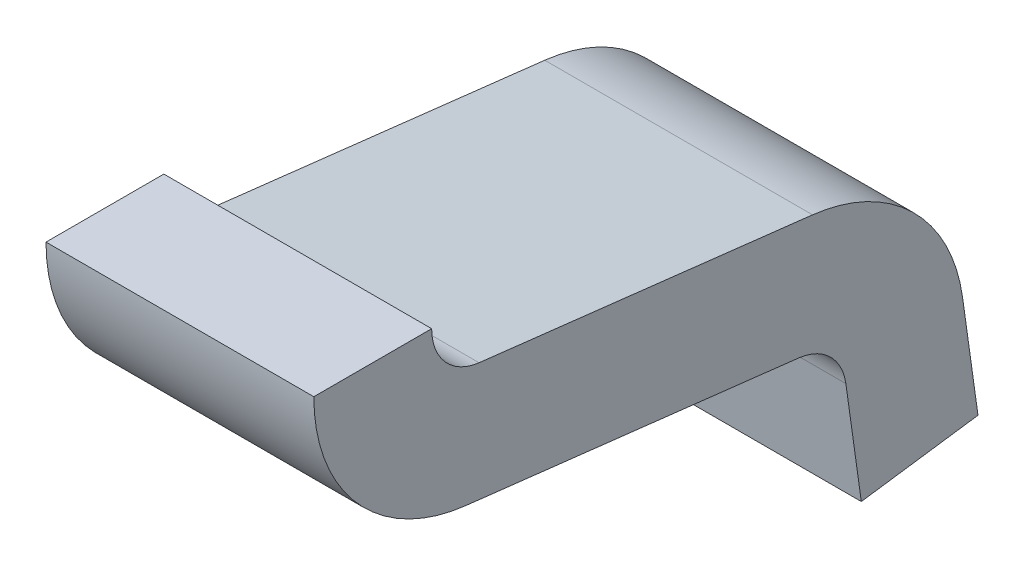
ISO-10303-21;
HEADER;
FILE_DESCRIPTION(('STEP AP214'),'2;1');
FILE_NAME('part.step','',(''),(''),'','','');
FILE_SCHEMA(('AUTOMOTIVE_DESIGN { 1 0 10303 214 1 1 1 1 }'));
ENDSEC;
DATA;
#1=APPLICATION_CONTEXT('core data for automotive mechanical design processes');
#2=APPLICATION_PROTOCOL_DEFINITION('international standard','automotive_design',2000,#1);
#3=PRODUCT_CONTEXT('',#1,'mechanical');
#4=PRODUCT('Part','Part','',(#3));
#5=PRODUCT_RELATED_PRODUCT_CATEGORY('part','',(#4));
#6=PRODUCT_DEFINITION_FORMATION('','',#4);
#7=PRODUCT_DEFINITION_CONTEXT('part definition',#1,'design');
#8=PRODUCT_DEFINITION('design','',#6,#7);
#9=PRODUCT_DEFINITION_SHAPE('','',#8);
#10=(LENGTH_UNIT() NAMED_UNIT(*) SI_UNIT(.MILLI.,.METRE.));
#11=(NAMED_UNIT(*) PLANE_ANGLE_UNIT() SI_UNIT($,.RADIAN.));
#12=(NAMED_UNIT(*) SI_UNIT($,.STERADIAN.) SOLID_ANGLE_UNIT());
#13=UNCERTAINTY_MEASURE_WITH_UNIT(LENGTH_MEASURE(1.E-05),#10,'distance_accuracy_value','');
#14=(GEOMETRIC_REPRESENTATION_CONTEXT(3) GLOBAL_UNCERTAINTY_ASSIGNED_CONTEXT((#13)) GLOBAL_UNIT_ASSIGNED_CONTEXT((#10,
#11,#12)) REPRESENTATION_CONTEXT('',''));
#15=CARTESIAN_POINT('',(0.,0.,0.));
#16=DIRECTION('',(0.,0.,1.));
#17=DIRECTION('',(1.,0.,0.));
#18=AXIS2_PLACEMENT_3D('',#15,#16,#17);
#19=CARTESIAN_POINT('',(0.5,-0.03061808221121,0.217858975123));
#20=DIRECTION('',(0.,0.990268068741588,0.139173100959942));
#21=DIRECTION('',(0.,-0.139173100959942,0.990268068741588));
#22=AXIS2_PLACEMENT_3D('',#19,#20,#21);
#23=PLANE('',#22);
#24=DIRECTION('',(0.,0.139173100960136,-0.99026806874156));
#25=VECTOR('',#24,1.);
#26=CARTESIAN_POINT('',(0.5,-0.03061808221121,0.217858975123));
#27=LINE('',#26,#25);
#28=CARTESIAN_POINT('',(0.5,-0.0306180822112133,0.217858975123023));
#29=VERTEX_POINT('',#28);
#30=CARTESIAN_POINT('',(0.5,0.,0.));
#31=VERTEX_POINT('',#30);
#32=EDGE_CURVE('E108',#29,#31,#27,.T.);
#33=ORIENTED_EDGE('',*,*,#32,.F.);
#34=DIRECTION('',(1.,0.,0.));
#35=VECTOR('',#34,1.);
#36=CARTESIAN_POINT('',(0.5,-0.0306180822112199,0.21785897512307));
#37=LINE('',#36,#35);
#38=CARTESIAN_POINT('',(0.,-0.0306180822112149,0.217858975123035));
#39=VERTEX_POINT('',#38);
#40=EDGE_CURVE('E161',#29,#39,#37,.F.);
#41=ORIENTED_EDGE('',*,*,#40,.T.);
#42=DIRECTION('',(0.,0.139173100960136,-0.99026806874156));
#43=VECTOR('',#42,1.);
#44=CARTESIAN_POINT('',(0.,-0.03061808221121,0.217858975123));
#45=LINE('',#44,#43);
#46=CARTESIAN_POINT('',(0.,0.,0.));
#47=VERTEX_POINT('',#46);
#48=EDGE_CURVE('E100',#39,#47,#45,.T.);
#49=ORIENTED_EDGE('',*,*,#48,.T.);
#50=DIRECTION('',(1.,0.,0.));
#51=VECTOR('',#50,1.);
#52=CARTESIAN_POINT('',(0.5,0.,0.));
#53=LINE('',#52,#51);
#54=EDGE_CURVE('E94',#47,#31,#53,.T.);
#55=ORIENTED_EDGE('',*,*,#54,.T.);
#56=EDGE_LOOP('',(#33,#41,#49,#55));
#57=FACE_BOUND('',#56,.T.);
#58=ADVANCED_FACE('F17',(#57),#23,.F.);
#59=CARTESIAN_POINT('',(0.5,0.,0.));
#60=DIRECTION('',(0.,-0.139173100959942,0.990268068741588));
#61=DIRECTION('',(0.,-0.990268068741588,-0.139173100959942));
#62=AXIS2_PLACEMENT_3D('',#59,#60,#61);
#63=PLANE('',#62);
#64=DIRECTION('',(0.,0.990268068741601,0.139173100959849));
#65=VECTOR('',#64,1.);
#66=CARTESIAN_POINT('',(0.5,0.,0.));
#67=LINE('',#66,#65);
#68=CARTESIAN_POINT('',(0.5,0.205141142117576,0.0288307073448538));
#69=VERTEX_POINT('',#68);
#70=EDGE_CURVE('E110',#31,#69,#67,.T.);
#71=ORIENTED_EDGE('',*,*,#70,.F.);
#72=ORIENTED_EDGE('',*,*,#54,.F.);
#73=DIRECTION('',(0.,0.990268068741601,0.139173100959849));
#74=VECTOR('',#73,1.);
#75=CARTESIAN_POINT('',(0.,0.,0.));
#76=LINE('',#75,#74);
#77=CARTESIAN_POINT('',(0.,0.205141142117576,0.0288307073448538));
#78=VERTEX_POINT('',#77);
#79=EDGE_CURVE('E151',#47,#78,#76,.T.);
#80=ORIENTED_EDGE('',*,*,#79,.T.);
#81=DIRECTION('',(-1.,0.,0.));
#82=VECTOR('',#81,1.);
#83=CARTESIAN_POINT('',(0.5,0.205141142118029,0.0288307073448111));
#84=LINE('',#83,#82);
#85=EDGE_CURVE('E85',#69,#78,#84,.T.);
#86=ORIENTED_EDGE('',*,*,#85,.F.);
#87=EDGE_LOOP('',(#71,#72,#80,#86));
#88=FACE_BOUND('',#87,.T.);
#89=ADVANCED_FACE('F115',(#88),#63,.F.);
#90=CARTESIAN_POINT('',(0.5,0.16060574981,0.345716489342));
#91=DIRECTION('',(-1.,0.,0.));
#92=DIRECTION('',(0.,0.,1.));
#93=AXIS2_PLACEMENT_3D('',#90,#91,#92);
#94=CYLINDRICAL_SURFACE('',#93,0.32);
#95=CARTESIAN_POINT('',(0.,0.16060574981,0.345716489342));
#96=DIRECTION('',(-1.,0.,0.));
#97=DIRECTION('',(0.,0.,1.));
#98=AXIS2_PLACEMENT_3D('',#95,#96,#97);
#99=CIRCLE('',#98,0.32);
#100=CARTESIAN_POINT('',(0.,0.478476552255959,0.308863362572648));
#101=VERTEX_POINT('',#100);
#102=EDGE_CURVE('E20',#78,#101,#99,.F.);
#103=ORIENTED_EDGE('',*,*,#102,.T.);
#104=DIRECTION('',(1.,0.,0.));
#105=VECTOR('',#104,1.);
#106=CARTESIAN_POINT('',(0.5,0.478476552256,0.308863362573));
#107=LINE('',#106,#105);
#108=CARTESIAN_POINT('',(0.5,0.478476552255959,0.308863362572648));
#109=VERTEX_POINT('',#108);
#110=EDGE_CURVE('E165',#101,#109,#107,.T.);
#111=ORIENTED_EDGE('',*,*,#110,.T.);
#112=CARTESIAN_POINT('',(0.5,0.16060574981,0.345716489342));
#113=DIRECTION('',(-1.,0.,0.));
#114=DIRECTION('',(0.,0.,1.));
#115=AXIS2_PLACEMENT_3D('',#112,#113,#114);
#116=CIRCLE('',#115,0.32);
#117=EDGE_CURVE('E116',#69,#109,#116,.F.);
#118=ORIENTED_EDGE('',*,*,#117,.F.);
#119=ORIENTED_EDGE('',*,*,#85,.T.);
#120=EDGE_LOOP('',(#103,#111,#118,#119));
#121=FACE_BOUND('',#120,.T.);
#122=ADVANCED_FACE('F201',(#121),#94,.T.);
#123=CARTESIAN_POINT('',(0.5,0.478476552256,0.308863362573));
#124=DIRECTION('',(0.,-0.99334625764198,0.115166021154998));
#125=DIRECTION('',(0.,-0.115166021154998,-0.99334625764198));
#126=AXIS2_PLACEMENT_3D('',#123,#124,#125);
#127=PLANE('',#126);
#128=DIRECTION('',(0.,0.115166021155147,0.993346257641962));
#129=VECTOR('',#128,1.);
#130=CARTESIAN_POINT('',(0.5,0.478476552256,0.308863362573));
#131=LINE('',#130,#129);
#132=CARTESIAN_POINT('',(0.5,0.550665374235902,0.931516602115257));
#133=VERTEX_POINT('',#132);
#134=EDGE_CURVE('E118',#109,#133,#131,.T.);
#135=ORIENTED_EDGE('',*,*,#134,.F.);
#136=ORIENTED_EDGE('',*,*,#110,.F.);
#137=DIRECTION('',(0.,0.115166021155147,0.993346257641962));
#138=VECTOR('',#137,1.);
#139=CARTESIAN_POINT('',(0.,0.478476552256,0.308863362573));
#140=LINE('',#139,#138);
#141=CARTESIAN_POINT('',(0.,0.550665374235902,0.931516602115257));
#142=VERTEX_POINT('',#141);
#143=EDGE_CURVE('E148',#101,#142,#140,.T.);
#144=ORIENTED_EDGE('',*,*,#143,.T.);
#145=DIRECTION('',(-1.,0.,0.));
#146=VECTOR('',#145,1.);
#147=CARTESIAN_POINT('',(0.5,0.550665374235748,0.931516602115029));
#148=LINE('',#147,#146);
#149=EDGE_CURVE('E162',#142,#133,#148,.F.);
#150=ORIENTED_EDGE('',*,*,#149,.T.);
#151=EDGE_LOOP('',(#135,#136,#144,#150));
#152=FACE_BOUND('',#151,.T.);
#153=ADVANCED_FACE('F200',(#152),#127,.F.);
#154=CARTESIAN_POINT('',(0.5,0.65,0.92));
#155=DIRECTION('',(-1.,0.,0.));
#156=DIRECTION('',(0.,0.,1.));
#157=AXIS2_PLACEMENT_3D('',#154,#155,#156);
#158=CYLINDRICAL_SURFACE('',#157,0.1);
#159=CARTESIAN_POINT('',(0.5,0.65,0.92));
#160=DIRECTION('',(-1.,0.,0.));
#161=DIRECTION('',(0.,0.,1.));
#162=AXIS2_PLACEMENT_3D('',#159,#160,#161);
#163=CIRCLE('',#162,0.1);
#164=CARTESIAN_POINT('',(0.5,0.65,1.02));
#165=VERTEX_POINT('',#164);
#166=EDGE_CURVE('E186',#133,#165,#163,.T.);
#167=ORIENTED_EDGE('',*,*,#166,.F.);
#168=ORIENTED_EDGE('',*,*,#149,.F.);
#169=CARTESIAN_POINT('',(0.,0.65,0.92));
#170=DIRECTION('',(-1.,0.,0.));
#171=DIRECTION('',(0.,0.,1.));
#172=AXIS2_PLACEMENT_3D('',#169,#170,#171);
#173=CIRCLE('',#172,0.1);
#174=CARTESIAN_POINT('',(0.,0.65,1.02));
#175=VERTEX_POINT('',#174);
#176=EDGE_CURVE('E147',#142,#175,#173,.T.);
#177=ORIENTED_EDGE('',*,*,#176,.T.);
#178=DIRECTION('',(1.,0.,0.));
#179=VECTOR('',#178,1.);
#180=CARTESIAN_POINT('',(0.5,0.65,1.02));
#181=LINE('',#180,#179);
#182=EDGE_CURVE('E158',#175,#165,#181,.T.);
#183=ORIENTED_EDGE('',*,*,#182,.T.);
#184=EDGE_LOOP('',(#167,#168,#177,#183));
#185=FACE_BOUND('',#184,.T.);
#186=ADVANCED_FACE('F192',(#185),#158,.F.);
#187=CARTESIAN_POINT('',(0.5,0.65,1.02));
#188=DIRECTION('',(0.,-1.,0.));
#189=DIRECTION('',(0.,0.,-1.));
#190=AXIS2_PLACEMENT_3D('',#187,#188,#189);
#191=PLANE('',#190);
#192=DIRECTION('',(0.,0.,-1.));
#193=VECTOR('',#192,1.);
#194=CARTESIAN_POINT('',(0.5,0.65,0.345716489342));
#195=LINE('',#194,#193);
#196=CARTESIAN_POINT('',(0.5,0.65,1.24));
#197=VERTEX_POINT('',#196);
#198=EDGE_CURVE('E185',#165,#197,#195,.F.);
#199=ORIENTED_EDGE('',*,*,#198,.F.);
#200=ORIENTED_EDGE('',*,*,#182,.F.);
#201=DIRECTION('',(0.,0.,-1.));
#202=VECTOR('',#201,1.);
#203=CARTESIAN_POINT('',(0.,0.65,0.345716489342));
#204=LINE('',#203,#202);
#205=CARTESIAN_POINT('',(0.,0.65,1.24));
#206=VERTEX_POINT('',#205);
#207=EDGE_CURVE('E142',#175,#206,#204,.F.);
#208=ORIENTED_EDGE('',*,*,#207,.T.);
#209=DIRECTION('',(-1.,0.,0.));
#210=VECTOR('',#209,1.);
#211=CARTESIAN_POINT('',(0.5,0.65,1.24));
#212=LINE('',#211,#210);
#213=EDGE_CURVE('E141',#197,#206,#212,.T.);
#214=ORIENTED_EDGE('',*,*,#213,.F.);
#215=EDGE_LOOP('',(#199,#200,#208,#214));
#216=FACE_BOUND('',#215,.T.);
#217=ADVANCED_FACE('F206',(#216),#191,.F.);
#218=CARTESIAN_POINT('',(0.5,0.174523059906,0.246689682468));
#219=DIRECTION('',(0.,0.139173100959942,-0.990268068741588));
#220=DIRECTION('',(0.,0.990268068741588,0.139173100959942));
#221=AXIS2_PLACEMENT_3D('',#218,#219,#220);
#222=PLANE('',#221);
#223=DIRECTION('',(0.,-0.99026806874154,-0.13917310096028));
#224=VECTOR('',#223,1.);
#225=CARTESIAN_POINT('',(0.5,0.174523059906,0.246689682468));
#226=LINE('',#225,#224);
#227=CARTESIAN_POINT('',(0.5,0.174523059906014,0.246689682467923));
#228=VERTEX_POINT('',#227);
#229=EDGE_CURVE('E111',#228,#29,#226,.T.);
#230=ORIENTED_EDGE('',*,*,#229,.F.);
#231=DIRECTION('',(-1.,0.,0.));
#232=VECTOR('',#231,1.);
#233=CARTESIAN_POINT('',(0.5,0.174523059906022,0.246689682467845));
#234=LINE('',#233,#232);
#235=CARTESIAN_POINT('',(0.,0.174523059906014,0.246689682467923));
#236=VERTEX_POINT('',#235);
#237=EDGE_CURVE('E137',#228,#236,#234,.T.);
#238=ORIENTED_EDGE('',*,*,#237,.T.);
#239=DIRECTION('',(0.,-0.99026806874154,-0.13917310096028));
#240=VECTOR('',#239,1.);
#241=CARTESIAN_POINT('',(0.,0.174523059906,0.246689682468));
#242=LINE('',#241,#240);
#243=EDGE_CURVE('E138',#236,#39,#242,.T.);
#244=ORIENTED_EDGE('',*,*,#243,.T.);
#245=ORIENTED_EDGE('',*,*,#40,.F.);
#246=EDGE_LOOP('',(#230,#238,#244,#245));
#247=FACE_BOUND('',#246,.T.);
#248=ADVANCED_FACE('F228',(#247),#222,.F.);
#249=CARTESIAN_POINT('',(0.,0.16060574981,0.345716489342));
#250=DIRECTION('',(1.,0.,0.));
#251=DIRECTION('',(0.,0.,-1.));
#252=AXIS2_PLACEMENT_3D('',#249,#250,#251);
#253=PLANE('',#252);
#254=CARTESIAN_POINT('',(0.,0.16060574981,0.345716489342));
#255=DIRECTION('',(-1.,0.,0.));
#256=DIRECTION('',(0.,0.,1.));
#257=AXIS2_PLACEMENT_3D('',#254,#255,#256);
#258=CIRCLE('',#257,0.1);
#259=CARTESIAN_POINT('',(0.,0.259940375574945,0.33419988722671));
#260=VERTEX_POINT('',#259);
#261=EDGE_CURVE('E180',#236,#260,#258,.F.);
#262=ORIENTED_EDGE('',*,*,#261,.T.);
#263=DIRECTION('',(0.,0.115166021154998,0.99334625764198));
#264=VECTOR('',#263,1.);
#265=CARTESIAN_POINT('',(0.,0.332129197555,0.95685312677));
#266=LINE('',#265,#264);
#267=CARTESIAN_POINT('',(0.,0.332129197554974,0.956853126769778));
#268=VERTEX_POINT('',#267);
#269=EDGE_CURVE('E132',#260,#268,#266,.T.);
#270=ORIENTED_EDGE('',*,*,#269,.T.);
#271=CARTESIAN_POINT('',(0.,0.65,0.92));
#272=DIRECTION('',(-1.,0.,0.));
#273=DIRECTION('',(0.,0.,1.));
#274=AXIS2_PLACEMENT_3D('',#271,#272,#273);
#275=CIRCLE('',#274,0.32);
#276=EDGE_CURVE('E126',#206,#268,#275,.F.);
#277=ORIENTED_EDGE('',*,*,#276,.F.);
#278=ORIENTED_EDGE('',*,*,#207,.F.);
#279=ORIENTED_EDGE('',*,*,#176,.F.);
#280=ORIENTED_EDGE('',*,*,#143,.F.);
#281=ORIENTED_EDGE('',*,*,#102,.F.);
#282=ORIENTED_EDGE('',*,*,#79,.F.);
#283=ORIENTED_EDGE('',*,*,#48,.F.);
#284=ORIENTED_EDGE('',*,*,#243,.F.);
#285=EDGE_LOOP('',(#262,#270,#277,#278,#279,#280,#281,#282,#283,#284));
#286=FACE_BOUND('',#285,.T.);
#287=ADVANCED_FACE('F196',(#286),#253,.F.);
#288=CARTESIAN_POINT('',(0.5,0.65,0.92));
#289=DIRECTION('',(-1.,0.,0.));
#290=DIRECTION('',(0.,0.,1.));
#291=AXIS2_PLACEMENT_3D('',#288,#289,#290);
#292=CYLINDRICAL_SURFACE('',#291,0.32);
#293=ORIENTED_EDGE('',*,*,#276,.T.);
#294=DIRECTION('',(1.,0.,0.));
#295=VECTOR('',#294,1.);
#296=CARTESIAN_POINT('',(0.5,0.332129197555,0.95685312677));
#297=LINE('',#296,#295);
#298=CARTESIAN_POINT('',(0.5,0.332129197554974,0.956853126769778));
#299=VERTEX_POINT('',#298);
#300=EDGE_CURVE('E129',#268,#299,#297,.T.);
#301=ORIENTED_EDGE('',*,*,#300,.T.);
#302=CARTESIAN_POINT('',(0.5,0.65,0.92));
#303=DIRECTION('',(-1.,0.,0.));
#304=DIRECTION('',(0.,0.,1.));
#305=AXIS2_PLACEMENT_3D('',#302,#303,#304);
#306=CIRCLE('',#305,0.32);
#307=EDGE_CURVE('E183',#197,#299,#306,.F.);
#308=ORIENTED_EDGE('',*,*,#307,.F.);
#309=ORIENTED_EDGE('',*,*,#213,.T.);
#310=EDGE_LOOP('',(#293,#301,#308,#309));
#311=FACE_BOUND('',#310,.T.);
#312=ADVANCED_FACE('F208',(#311),#292,.T.);
#313=CARTESIAN_POINT('',(0.5,0.16060574981,0.345716489342));
#314=DIRECTION('',(1.,0.,0.));
#315=DIRECTION('',(0.,0.,-1.));
#316=AXIS2_PLACEMENT_3D('',#313,#314,#315);
#317=PLANE('',#316);
#318=ORIENTED_EDGE('',*,*,#307,.T.);
#319=DIRECTION('',(0.,0.115166021154998,0.99334625764198));
#320=VECTOR('',#319,1.);
#321=CARTESIAN_POINT('',(0.5,0.332129197555,0.95685312677));
#322=LINE('',#321,#320);
#323=CARTESIAN_POINT('',(0.5,0.259940375574945,0.33419988722671));
#324=VERTEX_POINT('',#323);
#325=EDGE_CURVE('E26',#299,#324,#322,.F.);
#326=ORIENTED_EDGE('',*,*,#325,.T.);
#327=CARTESIAN_POINT('',(0.5,0.16060574981,0.345716489342));
#328=DIRECTION('',(-1.,0.,0.));
#329=DIRECTION('',(0.,0.,1.));
#330=AXIS2_PLACEMENT_3D('',#327,#328,#329);
#331=CIRCLE('',#330,0.1);
#332=EDGE_CURVE('E34',#324,#228,#331,.T.);
#333=ORIENTED_EDGE('',*,*,#332,.T.);
#334=ORIENTED_EDGE('',*,*,#229,.T.);
#335=ORIENTED_EDGE('',*,*,#32,.T.);
#336=ORIENTED_EDGE('',*,*,#70,.T.);
#337=ORIENTED_EDGE('',*,*,#117,.T.);
#338=ORIENTED_EDGE('',*,*,#134,.T.);
#339=ORIENTED_EDGE('',*,*,#166,.T.);
#340=ORIENTED_EDGE('',*,*,#198,.T.);
#341=EDGE_LOOP('',(#318,#326,#333,#334,#335,#336,#337,#338,#339,#340));
#342=FACE_BOUND('',#341,.T.);
#343=ADVANCED_FACE('F109',(#342),#317,.T.);
#344=CARTESIAN_POINT('',(0.5,0.16060574981,0.345716489342));
#345=DIRECTION('',(-1.,0.,0.));
#346=DIRECTION('',(0.,0.,1.));
#347=AXIS2_PLACEMENT_3D('',#344,#345,#346);
#348=CYLINDRICAL_SURFACE('',#347,0.1);
#349=ORIENTED_EDGE('',*,*,#332,.F.);
#350=DIRECTION('',(1.,0.,0.));
#351=VECTOR('',#350,1.);
#352=CARTESIAN_POINT('',(0.5,0.259940375574979,0.334199887227002));
#353=LINE('',#352,#351);
#354=EDGE_CURVE('E11',#324,#260,#353,.F.);
#355=ORIENTED_EDGE('',*,*,#354,.T.);
#356=ORIENTED_EDGE('',*,*,#261,.F.);
#357=ORIENTED_EDGE('',*,*,#237,.F.);
#358=EDGE_LOOP('',(#349,#355,#356,#357));
#359=FACE_BOUND('',#358,.T.);
#360=ADVANCED_FACE('F213',(#359),#348,.F.);
#361=CARTESIAN_POINT('',(0.5,0.332129197555,0.95685312677));
#362=DIRECTION('',(0.,0.99334625764198,-0.115166021154998));
#363=DIRECTION('',(0.,0.115166021154998,0.99334625764198));
#364=AXIS2_PLACEMENT_3D('',#361,#362,#363);
#365=PLANE('',#364);
#366=ORIENTED_EDGE('',*,*,#325,.F.);
#367=ORIENTED_EDGE('',*,*,#300,.F.);
#368=ORIENTED_EDGE('',*,*,#269,.F.);
#369=ORIENTED_EDGE('',*,*,#354,.F.);
#370=EDGE_LOOP('',(#366,#367,#368,#369));
#371=FACE_BOUND('',#370,.T.);
#372=ADVANCED_FACE('F211',(#371),#365,.F.);
#373=CLOSED_SHELL('',(#58,#89,#122,#153,#186,#217,#248,#287,#312,#343,#360,#372));
#374=MANIFOLD_SOLID_BREP('B1',#373);
#375=ADVANCED_BREP_SHAPE_REPRESENTATION('',(#18,#374),#14);
#376=SHAPE_DEFINITION_REPRESENTATION(#9,#375);
ENDSEC;
END-ISO-10303-21;
